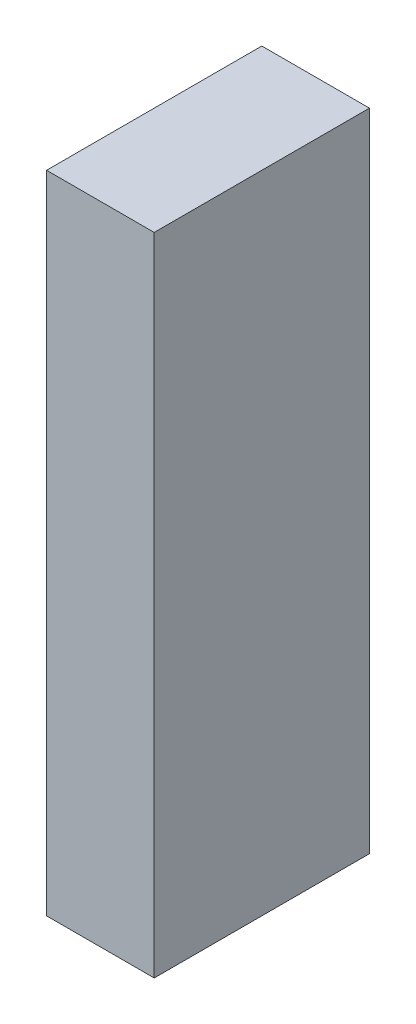
ISO-10303-21;
HEADER;
FILE_DESCRIPTION(('STEP AP214'),'2;1');
FILE_NAME('part.step','',(''),(''),'','','');
FILE_SCHEMA(('AUTOMOTIVE_DESIGN { 1 0 10303 214 1 1 1 1 }'));
ENDSEC;
DATA;
#1=APPLICATION_CONTEXT('core data for automotive mechanical design processes');
#2=APPLICATION_PROTOCOL_DEFINITION('international standard','automotive_design',2000,#1);
#3=PRODUCT_CONTEXT('',#1,'mechanical');
#4=PRODUCT('Part','Part','',(#3));
#5=PRODUCT_RELATED_PRODUCT_CATEGORY('part','',(#4));
#6=PRODUCT_DEFINITION_FORMATION('','',#4);
#7=PRODUCT_DEFINITION_CONTEXT('part definition',#1,'design');
#8=PRODUCT_DEFINITION('design','',#6,#7);
#9=PRODUCT_DEFINITION_SHAPE('','',#8);
#10=(LENGTH_UNIT() NAMED_UNIT(*) SI_UNIT(.MILLI.,.METRE.));
#11=(NAMED_UNIT(*) PLANE_ANGLE_UNIT() SI_UNIT($,.RADIAN.));
#12=(NAMED_UNIT(*) SI_UNIT($,.STERADIAN.) SOLID_ANGLE_UNIT());
#13=UNCERTAINTY_MEASURE_WITH_UNIT(LENGTH_MEASURE(1.E-05),#10,'distance_accuracy_value','');
#14=(GEOMETRIC_REPRESENTATION_CONTEXT(3) GLOBAL_UNCERTAINTY_ASSIGNED_CONTEXT((#13)) GLOBAL_UNIT_ASSIGNED_CONTEXT((#10,
#11,#12)) REPRESENTATION_CONTEXT('',''));
#15=CARTESIAN_POINT('',(0.,0.,0.));
#16=DIRECTION('',(0.,0.,1.));
#17=DIRECTION('',(1.,0.,0.));
#18=AXIS2_PLACEMENT_3D('',#15,#16,#17);
#19=CARTESIAN_POINT('',(0.,304.8,0.));
#20=DIRECTION('',(1.,0.,0.));
#21=DIRECTION('',(0.,0.,-1.));
#22=AXIS2_PLACEMENT_3D('',#19,#20,#21);
#23=PLANE('',#22);
#24=DIRECTION('',(0.,0.,1.));
#25=VECTOR('',#24,1.);
#26=CARTESIAN_POINT('',(0.,0.,0.));
#27=LINE('',#26,#25);
#28=CARTESIAN_POINT('',(0.,0.,-101.6));
#29=VERTEX_POINT('',#28);
#30=CARTESIAN_POINT('',(0.,0.,0.));
#31=VERTEX_POINT('',#30);
#32=EDGE_CURVE('E107',#29,#31,#27,.T.);
#33=ORIENTED_EDGE('',*,*,#32,.T.);
#34=DIRECTION('',(0.,-1.,0.));
#35=VECTOR('',#34,1.);
#36=CARTESIAN_POINT('',(0.,304.8,0.));
#37=LINE('',#36,#35);
#38=CARTESIAN_POINT('',(0.,304.8,0.));
#39=VERTEX_POINT('',#38);
#40=EDGE_CURVE('E11',#39,#31,#37,.T.);
#41=ORIENTED_EDGE('',*,*,#40,.F.);
#42=DIRECTION('',(0.,0.,1.));
#43=VECTOR('',#42,1.);
#44=CARTESIAN_POINT('',(0.,304.8,0.));
#45=LINE('',#44,#43);
#46=CARTESIAN_POINT('',(0.,304.8,-101.6));
#47=VERTEX_POINT('',#46);
#48=EDGE_CURVE('E91',#47,#39,#45,.T.);
#49=ORIENTED_EDGE('',*,*,#48,.F.);
#50=DIRECTION('',(0.,-1.,0.));
#51=VECTOR('',#50,1.);
#52=CARTESIAN_POINT('',(0.,304.8,-101.6));
#53=LINE('',#52,#51);
#54=EDGE_CURVE('E103',#47,#29,#53,.T.);
#55=ORIENTED_EDGE('',*,*,#54,.T.);
#56=EDGE_LOOP('',(#33,#41,#49,#55));
#57=FACE_BOUND('',#56,.T.);
#58=ADVANCED_FACE('F39',(#57),#23,.F.);
#59=CARTESIAN_POINT('',(0.,304.8,0.));
#60=DIRECTION('',(0.,0.,-1.));
#61=DIRECTION('',(-1.,0.,0.));
#62=AXIS2_PLACEMENT_3D('',#59,#60,#61);
#63=PLANE('',#62);
#64=DIRECTION('',(1.,0.,0.));
#65=VECTOR('',#64,1.);
#66=CARTESIAN_POINT('',(0.,0.,0.));
#67=LINE('',#66,#65);
#68=CARTESIAN_POINT('',(50.8,0.,0.));
#69=VERTEX_POINT('',#68);
#70=EDGE_CURVE('E96',#31,#69,#67,.T.);
#71=ORIENTED_EDGE('',*,*,#70,.T.);
#72=DIRECTION('',(0.,-1.,0.));
#73=VECTOR('',#72,1.);
#74=CARTESIAN_POINT('',(50.8,304.8,0.));
#75=LINE('',#74,#73);
#76=CARTESIAN_POINT('',(50.8,304.8,0.));
#77=VERTEX_POINT('',#76);
#78=EDGE_CURVE('E48',#77,#69,#75,.T.);
#79=ORIENTED_EDGE('',*,*,#78,.F.);
#80=DIRECTION('',(1.,0.,0.));
#81=VECTOR('',#80,1.);
#82=CARTESIAN_POINT('',(0.,304.8,0.));
#83=LINE('',#82,#81);
#84=EDGE_CURVE('E86',#39,#77,#83,.T.);
#85=ORIENTED_EDGE('',*,*,#84,.F.);
#86=ORIENTED_EDGE('',*,*,#40,.T.);
#87=EDGE_LOOP('',(#71,#79,#85,#86));
#88=FACE_BOUND('',#87,.T.);
#89=ADVANCED_FACE('F95',(#88),#63,.F.);
#90=CARTESIAN_POINT('',(50.8,304.8,0.));
#91=DIRECTION('',(-1.,0.,0.));
#92=DIRECTION('',(0.,0.,1.));
#93=AXIS2_PLACEMENT_3D('',#90,#91,#92);
#94=PLANE('',#93);
#95=DIRECTION('',(0.,0.,-1.));
#96=VECTOR('',#95,1.);
#97=CARTESIAN_POINT('',(50.8,0.,0.));
#98=LINE('',#97,#96);
#99=CARTESIAN_POINT('',(50.8,0.,-101.6));
#100=VERTEX_POINT('',#99);
#101=EDGE_CURVE('E73',#69,#100,#98,.T.);
#102=ORIENTED_EDGE('',*,*,#101,.T.);
#103=DIRECTION('',(0.,-1.,0.));
#104=VECTOR('',#103,1.);
#105=CARTESIAN_POINT('',(50.8,304.8,-101.6));
#106=LINE('',#105,#104);
#107=CARTESIAN_POINT('',(50.8,304.8,-101.6));
#108=VERTEX_POINT('',#107);
#109=EDGE_CURVE('E98',#108,#100,#106,.T.);
#110=ORIENTED_EDGE('',*,*,#109,.F.);
#111=DIRECTION('',(0.,0.,-1.));
#112=VECTOR('',#111,1.);
#113=CARTESIAN_POINT('',(50.8,304.8,0.));
#114=LINE('',#113,#112);
#115=EDGE_CURVE('E89',#77,#108,#114,.T.);
#116=ORIENTED_EDGE('',*,*,#115,.F.);
#117=ORIENTED_EDGE('',*,*,#78,.T.);
#118=EDGE_LOOP('',(#102,#110,#116,#117));
#119=FACE_BOUND('',#118,.T.);
#120=ADVANCED_FACE('F99',(#119),#94,.F.);
#121=CARTESIAN_POINT('',(0.,304.8,-101.6));
#122=DIRECTION('',(0.,0.,1.));
#123=DIRECTION('',(1.,0.,0.));
#124=AXIS2_PLACEMENT_3D('',#121,#122,#123);
#125=PLANE('',#124);
#126=DIRECTION('',(-1.,0.,0.));
#127=VECTOR('',#126,1.);
#128=CARTESIAN_POINT('',(0.,0.,-101.6));
#129=LINE('',#128,#127);
#130=EDGE_CURVE('E79',#100,#29,#129,.T.);
#131=ORIENTED_EDGE('',*,*,#130,.T.);
#132=ORIENTED_EDGE('',*,*,#54,.F.);
#133=DIRECTION('',(-1.,0.,0.));
#134=VECTOR('',#133,1.);
#135=CARTESIAN_POINT('',(0.,304.8,-101.6));
#136=LINE('',#135,#134);
#137=EDGE_CURVE('E56',#108,#47,#136,.T.);
#138=ORIENTED_EDGE('',*,*,#137,.F.);
#139=ORIENTED_EDGE('',*,*,#109,.T.);
#140=EDGE_LOOP('',(#131,#132,#138,#139));
#141=FACE_BOUND('',#140,.T.);
#142=ADVANCED_FACE('F120',(#141),#125,.F.);
#143=CARTESIAN_POINT('',(0.,304.8,0.));
#144=DIRECTION('',(0.,-1.,0.));
#145=DIRECTION('',(0.,0.,-1.));
#146=AXIS2_PLACEMENT_3D('',#143,#144,#145);
#147=PLANE('',#146);
#148=ORIENTED_EDGE('',*,*,#48,.T.);
#149=ORIENTED_EDGE('',*,*,#84,.T.);
#150=ORIENTED_EDGE('',*,*,#115,.T.);
#151=ORIENTED_EDGE('',*,*,#137,.T.);
#152=EDGE_LOOP('',(#148,#149,#150,#151));
#153=FACE_BOUND('',#152,.T.);
#154=ADVANCED_FACE('F87',(#153),#147,.F.);
#155=CARTESIAN_POINT('',(0.,0.,0.));
#156=DIRECTION('',(0.,-1.,0.));
#157=DIRECTION('',(0.,0.,-1.));
#158=AXIS2_PLACEMENT_3D('',#155,#156,#157);
#159=PLANE('',#158);
#160=ORIENTED_EDGE('',*,*,#32,.F.);
#161=ORIENTED_EDGE('',*,*,#130,.F.);
#162=ORIENTED_EDGE('',*,*,#101,.F.);
#163=ORIENTED_EDGE('',*,*,#70,.F.);
#164=EDGE_LOOP('',(#160,#161,#162,#163));
#165=FACE_BOUND('',#164,.T.);
#166=ADVANCED_FACE('F123',(#165),#159,.T.);
#167=CLOSED_SHELL('',(#58,#89,#120,#142,#154,#166));
#168=MANIFOLD_SOLID_BREP('B2',#167);
#169=ADVANCED_BREP_SHAPE_REPRESENTATION('',(#18,#168),#14);
#170=SHAPE_DEFINITION_REPRESENTATION(#9,#169);
ENDSEC;
END-ISO-10303-21;
